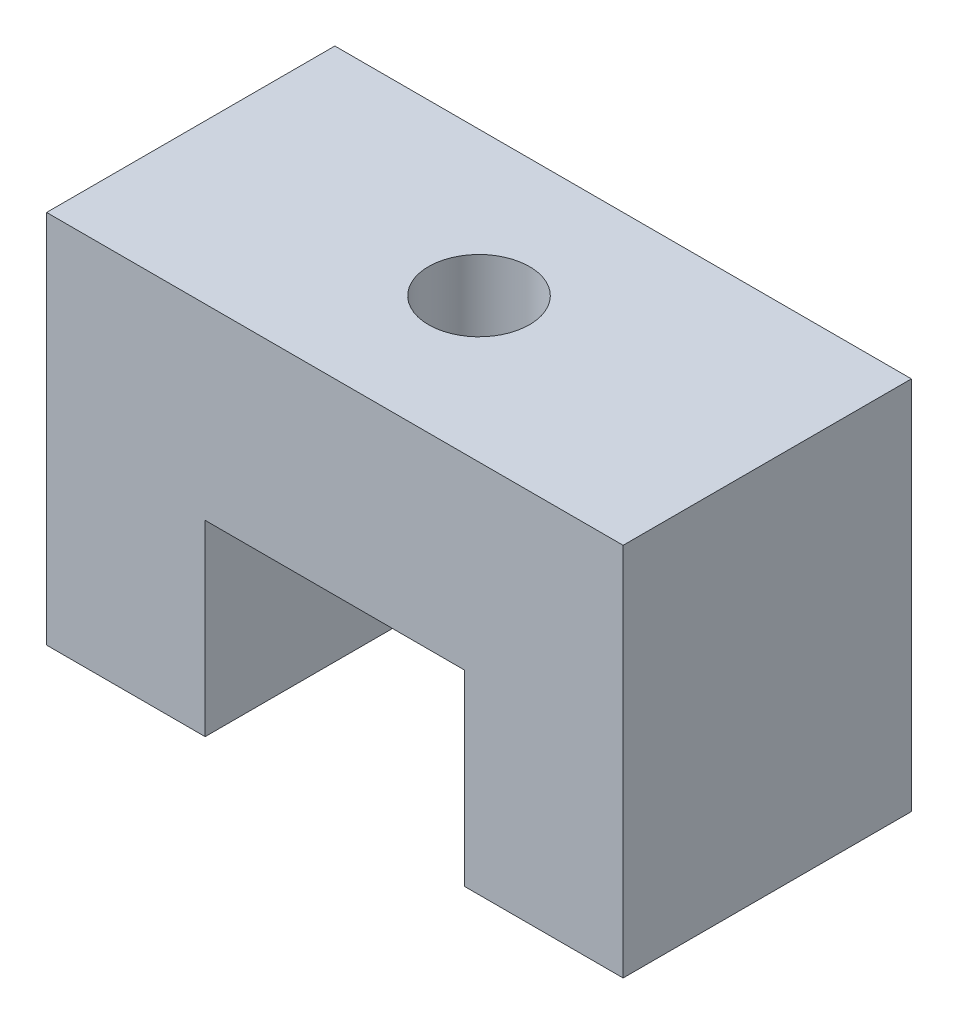
ISO-10303-21;
HEADER;
FILE_DESCRIPTION(('STEP AP214'),'2;1');
FILE_NAME('part.step','',(''),(''),'','','');
FILE_SCHEMA(('AUTOMOTIVE_DESIGN { 1 0 10303 214 1 1 1 1 }'));
ENDSEC;
DATA;
#1=APPLICATION_CONTEXT('core data for automotive mechanical design processes');
#2=APPLICATION_PROTOCOL_DEFINITION('international standard','automotive_design',2000,#1);
#3=PRODUCT_CONTEXT('',#1,'mechanical');
#4=PRODUCT('Part','Part','',(#3));
#5=PRODUCT_RELATED_PRODUCT_CATEGORY('part','',(#4));
#6=PRODUCT_DEFINITION_FORMATION('','',#4);
#7=PRODUCT_DEFINITION_CONTEXT('part definition',#1,'design');
#8=PRODUCT_DEFINITION('design','',#6,#7);
#9=PRODUCT_DEFINITION_SHAPE('','',#8);
#10=(LENGTH_UNIT() NAMED_UNIT(*) SI_UNIT(.MILLI.,.METRE.));
#11=(NAMED_UNIT(*) PLANE_ANGLE_UNIT() SI_UNIT($,.RADIAN.));
#12=(NAMED_UNIT(*) SI_UNIT($,.STERADIAN.) SOLID_ANGLE_UNIT());
#13=UNCERTAINTY_MEASURE_WITH_UNIT(LENGTH_MEASURE(1.E-05),#10,'distance_accuracy_value','');
#14=(GEOMETRIC_REPRESENTATION_CONTEXT(3) GLOBAL_UNCERTAINTY_ASSIGNED_CONTEXT((#13)) GLOBAL_UNIT_ASSIGNED_CONTEXT((#10,
#11,#12)) REPRESENTATION_CONTEXT('',''));
#15=CARTESIAN_POINT('',(0.,0.,0.));
#16=DIRECTION('',(0.,0.,1.));
#17=DIRECTION('',(1.,0.,0.));
#18=AXIS2_PLACEMENT_3D('',#15,#16,#17);
#19=CARTESIAN_POINT('',(0.,0.,5.));
#20=DIRECTION('',(0.,1.,0.));
#21=DIRECTION('',(-1.,0.,0.));
#22=AXIS2_PLACEMENT_3D('',#19,#20,#21);
#23=PLANE('',#22);
#24=CARTESIAN_POINT('',(0.,0.,0.));
#25=DIRECTION('',(0.,1.,0.));
#26=DIRECTION('',(-1.,0.,0.));
#27=AXIS2_PLACEMENT_3D('',#24,#25,#26);
#28=CIRCLE('',#27,1.75);
#29=CARTESIAN_POINT('',(0.,0.,1.75));
#30=VERTEX_POINT('',#29);
#31=EDGE_CURVE('E165',#30,#30,#28,.T.);
#32=ORIENTED_EDGE('',*,*,#31,.T.);
#33=EDGE_LOOP('',(#32));
#34=FACE_BOUND('',#33,.T.);
#35=DIRECTION('',(1.,0.,0.));
#36=VECTOR('',#35,1.);
#37=CARTESIAN_POINT('',(0.,0.,-5.));
#38=LINE('',#37,#36);
#39=CARTESIAN_POINT('',(-4.5,0.,-5.));
#40=VERTEX_POINT('',#39);
#41=CARTESIAN_POINT('',(4.5,0.,-5.));
#42=VERTEX_POINT('',#41);
#43=EDGE_CURVE('E168',#40,#42,#38,.T.);
#44=ORIENTED_EDGE('',*,*,#43,.T.);
#45=DIRECTION('',(0.,0.,-1.));
#46=VECTOR('',#45,1.);
#47=CARTESIAN_POINT('',(4.5,0.,5.));
#48=LINE('',#47,#46);
#49=CARTESIAN_POINT('',(4.5,0.,5.));
#50=VERTEX_POINT('',#49);
#51=EDGE_CURVE('E11',#50,#42,#48,.T.);
#52=ORIENTED_EDGE('',*,*,#51,.F.);
#53=DIRECTION('',(1.,0.,0.));
#54=VECTOR('',#53,1.);
#55=CARTESIAN_POINT('',(0.,0.,5.));
#56=LINE('',#55,#54);
#57=CARTESIAN_POINT('',(-4.5,0.,5.));
#58=VERTEX_POINT('',#57);
#59=EDGE_CURVE('E160',#58,#50,#56,.T.);
#60=ORIENTED_EDGE('',*,*,#59,.F.);
#61=DIRECTION('',(0.,0.,-1.));
#62=VECTOR('',#61,1.);
#63=CARTESIAN_POINT('',(-4.5,0.,5.));
#64=LINE('',#63,#62);
#65=EDGE_CURVE('E65',#58,#40,#64,.T.);
#66=ORIENTED_EDGE('',*,*,#65,.T.);
#67=EDGE_LOOP('',(#44,#52,#60,#66));
#68=FACE_BOUND('',#67,.T.);
#69=ADVANCED_FACE('F47',(#34,#68),#23,.F.);
#70=CARTESIAN_POINT('',(4.5,0.,5.));
#71=DIRECTION('',(1.,0.,0.));
#72=DIRECTION('',(0.,0.,-1.));
#73=AXIS2_PLACEMENT_3D('',#70,#71,#72);
#74=PLANE('',#73);
#75=DIRECTION('',(0.,-1.,0.));
#76=VECTOR('',#75,1.);
#77=CARTESIAN_POINT('',(4.5,0.,-5.));
#78=LINE('',#77,#76);
#79=CARTESIAN_POINT('',(4.5,-6.5,-5.));
#80=VERTEX_POINT('',#79);
#81=EDGE_CURVE('E172',#42,#80,#78,.T.);
#82=ORIENTED_EDGE('',*,*,#81,.T.);
#83=DIRECTION('',(0.,0.,-1.));
#84=VECTOR('',#83,1.);
#85=CARTESIAN_POINT('',(4.5,-6.5,5.));
#86=LINE('',#85,#84);
#87=CARTESIAN_POINT('',(4.5,-6.5,5.));
#88=VERTEX_POINT('',#87);
#89=EDGE_CURVE('E57',#88,#80,#86,.T.);
#90=ORIENTED_EDGE('',*,*,#89,.F.);
#91=DIRECTION('',(0.,-1.,0.));
#92=VECTOR('',#91,1.);
#93=CARTESIAN_POINT('',(4.5,0.,5.));
#94=LINE('',#93,#92);
#95=EDGE_CURVE('E104',#50,#88,#94,.T.);
#96=ORIENTED_EDGE('',*,*,#95,.F.);
#97=ORIENTED_EDGE('',*,*,#51,.T.);
#98=EDGE_LOOP('',(#82,#90,#96,#97));
#99=FACE_BOUND('',#98,.T.);
#100=ADVANCED_FACE('F238',(#99),#74,.F.);
#101=CARTESIAN_POINT('',(0.,-6.5,5.));
#102=DIRECTION('',(0.,1.,0.));
#103=DIRECTION('',(0.,0.,1.));
#104=AXIS2_PLACEMENT_3D('',#101,#102,#103);
#105=PLANE('',#104);
#106=DIRECTION('',(1.,0.,0.));
#107=VECTOR('',#106,1.);
#108=CARTESIAN_POINT('',(0.,-6.5,-5.));
#109=LINE('',#108,#107);
#110=CARTESIAN_POINT('',(10.,-6.5,-5.));
#111=VERTEX_POINT('',#110);
#112=EDGE_CURVE('E201',#80,#111,#109,.T.);
#113=ORIENTED_EDGE('',*,*,#112,.T.);
#114=DIRECTION('',(0.,0.,-1.));
#115=VECTOR('',#114,1.);
#116=CARTESIAN_POINT('',(10.,-6.5,5.));
#117=LINE('',#116,#115);
#118=CARTESIAN_POINT('',(10.,-6.5,5.));
#119=VERTEX_POINT('',#118);
#120=EDGE_CURVE('E214',#119,#111,#117,.T.);
#121=ORIENTED_EDGE('',*,*,#120,.F.);
#122=DIRECTION('',(1.,0.,0.));
#123=VECTOR('',#122,1.);
#124=CARTESIAN_POINT('',(0.,-6.5,5.));
#125=LINE('',#124,#123);
#126=EDGE_CURVE('E146',#88,#119,#125,.T.);
#127=ORIENTED_EDGE('',*,*,#126,.F.);
#128=ORIENTED_EDGE('',*,*,#89,.T.);
#129=EDGE_LOOP('',(#113,#121,#127,#128));
#130=FACE_BOUND('',#129,.T.);
#131=ADVANCED_FACE('F222',(#130),#105,.F.);
#132=CARTESIAN_POINT('',(10.,0.,5.));
#133=DIRECTION('',(1.,0.,0.));
#134=DIRECTION('',(0.,0.,-1.));
#135=AXIS2_PLACEMENT_3D('',#132,#133,#134);
#136=PLANE('',#135);
#137=DIRECTION('',(0.,-1.,0.));
#138=VECTOR('',#137,1.);
#139=CARTESIAN_POINT('',(10.,0.,-5.));
#140=LINE('',#139,#138);
#141=CARTESIAN_POINT('',(10.,6.5,-5.));
#142=VERTEX_POINT('',#141);
#143=EDGE_CURVE('E195',#142,#111,#140,.T.);
#144=ORIENTED_EDGE('',*,*,#143,.F.);
#145=DIRECTION('',(0.,0.,-1.));
#146=VECTOR('',#145,1.);
#147=CARTESIAN_POINT('',(10.,6.5,5.));
#148=LINE('',#147,#146);
#149=CARTESIAN_POINT('',(10.,6.5,5.));
#150=VERTEX_POINT('',#149);
#151=EDGE_CURVE('E191',#150,#142,#148,.T.);
#152=ORIENTED_EDGE('',*,*,#151,.F.);
#153=DIRECTION('',(0.,-1.,0.));
#154=VECTOR('',#153,1.);
#155=CARTESIAN_POINT('',(10.,0.,5.));
#156=LINE('',#155,#154);
#157=EDGE_CURVE('E153',#150,#119,#156,.T.);
#158=ORIENTED_EDGE('',*,*,#157,.T.);
#159=ORIENTED_EDGE('',*,*,#120,.T.);
#160=EDGE_LOOP('',(#144,#152,#158,#159));
#161=FACE_BOUND('',#160,.T.);
#162=ADVANCED_FACE('F186',(#161),#136,.T.);
#163=CARTESIAN_POINT('',(0.,6.5,5.));
#164=DIRECTION('',(0.,1.,0.));
#165=DIRECTION('',(0.,0.,1.));
#166=AXIS2_PLACEMENT_3D('',#163,#164,#165);
#167=PLANE('',#166);
#168=CARTESIAN_POINT('',(0.,6.5,0.));
#169=DIRECTION('',(0.,1.,0.));
#170=DIRECTION('',(0.,0.,1.));
#171=AXIS2_PLACEMENT_3D('',#168,#169,#170);
#172=CIRCLE('',#171,1.75);
#173=CARTESIAN_POINT('',(0.,6.5,1.75));
#174=VERTEX_POINT('',#173);
#175=EDGE_CURVE('E50',#174,#174,#172,.T.);
#176=ORIENTED_EDGE('',*,*,#175,.F.);
#177=EDGE_LOOP('',(#176));
#178=FACE_BOUND('',#177,.T.);
#179=DIRECTION('',(1.,0.,0.));
#180=VECTOR('',#179,1.);
#181=CARTESIAN_POINT('',(0.,6.5,-5.));
#182=LINE('',#181,#180);
#183=CARTESIAN_POINT('',(-10.,6.5,-5.));
#184=VERTEX_POINT('',#183);
#185=EDGE_CURVE('E190',#184,#142,#182,.T.);
#186=ORIENTED_EDGE('',*,*,#185,.F.);
#187=DIRECTION('',(0.,0.,-1.));
#188=VECTOR('',#187,1.);
#189=CARTESIAN_POINT('',(-10.,6.5,5.));
#190=LINE('',#189,#188);
#191=CARTESIAN_POINT('',(-10.,6.5,5.));
#192=VERTEX_POINT('',#191);
#193=EDGE_CURVE('E140',#192,#184,#190,.T.);
#194=ORIENTED_EDGE('',*,*,#193,.F.);
#195=DIRECTION('',(1.,0.,0.));
#196=VECTOR('',#195,1.);
#197=CARTESIAN_POINT('',(0.,6.5,5.));
#198=LINE('',#197,#196);
#199=EDGE_CURVE('E128',#192,#150,#198,.T.);
#200=ORIENTED_EDGE('',*,*,#199,.T.);
#201=ORIENTED_EDGE('',*,*,#151,.T.);
#202=EDGE_LOOP('',(#186,#194,#200,#201));
#203=FACE_BOUND('',#202,.T.);
#204=ADVANCED_FACE('F183',(#178,#203),#167,.T.);
#205=CARTESIAN_POINT('',(-10.,0.,5.));
#206=DIRECTION('',(1.,0.,0.));
#207=DIRECTION('',(0.,0.,-1.));
#208=AXIS2_PLACEMENT_3D('',#205,#206,#207);
#209=PLANE('',#208);
#210=DIRECTION('',(0.,-1.,0.));
#211=VECTOR('',#210,1.);
#212=CARTESIAN_POINT('',(-10.,0.,-5.));
#213=LINE('',#212,#211);
#214=CARTESIAN_POINT('',(-10.,-6.5,-5.));
#215=VERTEX_POINT('',#214);
#216=EDGE_CURVE('E136',#184,#215,#213,.T.);
#217=ORIENTED_EDGE('',*,*,#216,.T.);
#218=DIRECTION('',(0.,0.,-1.));
#219=VECTOR('',#218,1.);
#220=CARTESIAN_POINT('',(-10.,-6.5,5.));
#221=LINE('',#220,#219);
#222=CARTESIAN_POINT('',(-10.,-6.5,5.));
#223=VERTEX_POINT('',#222);
#224=EDGE_CURVE('E133',#223,#215,#221,.T.);
#225=ORIENTED_EDGE('',*,*,#224,.F.);
#226=DIRECTION('',(0.,-1.,0.));
#227=VECTOR('',#226,1.);
#228=CARTESIAN_POINT('',(-10.,0.,5.));
#229=LINE('',#228,#227);
#230=EDGE_CURVE('E120',#192,#223,#229,.T.);
#231=ORIENTED_EDGE('',*,*,#230,.F.);
#232=ORIENTED_EDGE('',*,*,#193,.T.);
#233=EDGE_LOOP('',(#217,#225,#231,#232));
#234=FACE_BOUND('',#233,.T.);
#235=ADVANCED_FACE('F134',(#234),#209,.F.);
#236=CARTESIAN_POINT('',(-4.5,-6.5,-5.));
#237=VERTEX_POINT('',#236);
#238=EDGE_CURVE('E198',#215,#237,#109,.T.);
#239=ORIENTED_EDGE('',*,*,#238,.T.);
#240=DIRECTION('',(0.,0.,-1.));
#241=VECTOR('',#240,1.);
#242=CARTESIAN_POINT('',(-4.5,-6.5,5.));
#243=LINE('',#242,#241);
#244=CARTESIAN_POINT('',(-4.5,-6.5,5.));
#245=VERTEX_POINT('',#244);
#246=EDGE_CURVE('E92',#245,#237,#243,.T.);
#247=ORIENTED_EDGE('',*,*,#246,.F.);
#248=EDGE_CURVE('E125',#223,#245,#125,.T.);
#249=ORIENTED_EDGE('',*,*,#248,.F.);
#250=ORIENTED_EDGE('',*,*,#224,.T.);
#251=EDGE_LOOP('',(#239,#247,#249,#250));
#252=FACE_BOUND('',#251,.T.);
#253=ADVANCED_FACE('F142',(#252),#105,.F.);
#254=CARTESIAN_POINT('',(-4.5,0.,5.));
#255=DIRECTION('',(1.,0.,0.));
#256=DIRECTION('',(0.,0.,-1.));
#257=AXIS2_PLACEMENT_3D('',#254,#255,#256);
#258=PLANE('',#257);
#259=DIRECTION('',(0.,-1.,0.));
#260=VECTOR('',#259,1.);
#261=CARTESIAN_POINT('',(-4.5,0.,-5.));
#262=LINE('',#261,#260);
#263=EDGE_CURVE('E162',#40,#237,#262,.T.);
#264=ORIENTED_EDGE('',*,*,#263,.F.);
#265=ORIENTED_EDGE('',*,*,#65,.F.);
#266=DIRECTION('',(0.,-1.,0.));
#267=VECTOR('',#266,1.);
#268=CARTESIAN_POINT('',(-4.5,0.,5.));
#269=LINE('',#268,#267);
#270=EDGE_CURVE('E144',#58,#245,#269,.T.);
#271=ORIENTED_EDGE('',*,*,#270,.T.);
#272=ORIENTED_EDGE('',*,*,#246,.T.);
#273=EDGE_LOOP('',(#264,#265,#271,#272));
#274=FACE_BOUND('',#273,.T.);
#275=ADVANCED_FACE('F228',(#274),#258,.T.);
#276=CARTESIAN_POINT('',(0.,0.,5.));
#277=DIRECTION('',(0.,0.,1.));
#278=DIRECTION('',(1.,0.,0.));
#279=AXIS2_PLACEMENT_3D('',#276,#277,#278);
#280=PLANE('',#279);
#281=ORIENTED_EDGE('',*,*,#59,.T.);
#282=ORIENTED_EDGE('',*,*,#95,.T.);
#283=ORIENTED_EDGE('',*,*,#126,.T.);
#284=ORIENTED_EDGE('',*,*,#157,.F.);
#285=ORIENTED_EDGE('',*,*,#199,.F.);
#286=ORIENTED_EDGE('',*,*,#230,.T.);
#287=ORIENTED_EDGE('',*,*,#248,.T.);
#288=ORIENTED_EDGE('',*,*,#270,.F.);
#289=EDGE_LOOP('',(#281,#282,#283,#284,#285,#286,#287,#288));
#290=FACE_BOUND('',#289,.T.);
#291=ADVANCED_FACE('F122',(#290),#280,.T.);
#292=CARTESIAN_POINT('',(0.,0.,-5.));
#293=DIRECTION('',(0.,0.,1.));
#294=DIRECTION('',(1.,0.,0.));
#295=AXIS2_PLACEMENT_3D('',#292,#293,#294);
#296=PLANE('',#295);
#297=ORIENTED_EDGE('',*,*,#43,.F.);
#298=ORIENTED_EDGE('',*,*,#263,.T.);
#299=ORIENTED_EDGE('',*,*,#238,.F.);
#300=ORIENTED_EDGE('',*,*,#216,.F.);
#301=ORIENTED_EDGE('',*,*,#185,.T.);
#302=ORIENTED_EDGE('',*,*,#143,.T.);
#303=ORIENTED_EDGE('',*,*,#112,.F.);
#304=ORIENTED_EDGE('',*,*,#81,.F.);
#305=EDGE_LOOP('',(#297,#298,#299,#300,#301,#302,#303,#304));
#306=FACE_BOUND('',#305,.T.);
#307=ADVANCED_FACE('F223',(#306),#296,.F.);
#308=CARTESIAN_POINT('',(0.,-6.5,0.));
#309=DIRECTION('',(0.,1.,0.));
#310=DIRECTION('',(0.,0.,1.));
#311=AXIS2_PLACEMENT_3D('',#308,#309,#310);
#312=CYLINDRICAL_SURFACE('',#311,1.75);
#313=CARTESIAN_POINT('',(0.,6.5,1.75));
#314=CARTESIAN_POINT('',(0.,6.43229166666667,1.75));
#315=CARTESIAN_POINT('',(0.,6.36458333333333,1.75));
#316=CARTESIAN_POINT('',(0.,6.22916666666667,1.75));
#317=CARTESIAN_POINT('',(0.,6.16145833333333,1.75));
#318=CARTESIAN_POINT('',(0.,6.02604166666667,1.75));
#319=CARTESIAN_POINT('',(0.,5.95833333333333,1.75));
#320=CARTESIAN_POINT('',(0.,5.82291666666666,1.75));
#321=CARTESIAN_POINT('',(0.,5.75520833333333,1.75));
#322=CARTESIAN_POINT('',(0.,5.61979166666667,1.75));
#323=CARTESIAN_POINT('',(0.,5.55208333333333,1.75));
#324=CARTESIAN_POINT('',(0.,5.41666666666667,1.75));
#325=CARTESIAN_POINT('',(0.,5.34895833333333,1.75));
#326=CARTESIAN_POINT('',(0.,5.21354166666667,1.75));
#327=CARTESIAN_POINT('',(0.,5.14583333333333,1.75));
#328=CARTESIAN_POINT('',(0.,5.01041666666667,1.75));
#329=CARTESIAN_POINT('',(0.,4.94270833333333,1.75));
#330=CARTESIAN_POINT('',(0.,4.80729166666667,1.75));
#331=CARTESIAN_POINT('',(0.,4.73958333333333,1.75));
#332=CARTESIAN_POINT('',(0.,4.60416666666667,1.75));
#333=CARTESIAN_POINT('',(0.,4.53645833333333,1.75));
#334=CARTESIAN_POINT('',(0.,4.40104166666667,1.75));
#335=CARTESIAN_POINT('',(0.,4.33333333333333,1.75));
#336=CARTESIAN_POINT('',(0.,4.19791666666667,1.75));
#337=CARTESIAN_POINT('',(0.,4.13020833333333,1.75));
#338=CARTESIAN_POINT('',(0.,3.99479166666666,1.75));
#339=CARTESIAN_POINT('',(0.,3.92708333333333,1.75));
#340=CARTESIAN_POINT('',(0.,3.79166666666667,1.75));
#341=CARTESIAN_POINT('',(0.,3.72395833333333,1.75));
#342=CARTESIAN_POINT('',(0.,3.58854166666666,1.75));
#343=CARTESIAN_POINT('',(0.,3.52083333333333,1.75));
#344=CARTESIAN_POINT('',(0.,3.38541666666667,1.75));
#345=CARTESIAN_POINT('',(0.,3.31770833333333,1.75));
#346=CARTESIAN_POINT('',(0.,3.18229166666667,1.75));
#347=CARTESIAN_POINT('',(0.,3.11458333333333,1.75));
#348=CARTESIAN_POINT('',(0.,2.97916666666666,1.75));
#349=CARTESIAN_POINT('',(0.,2.91145833333333,1.75));
#350=CARTESIAN_POINT('',(0.,2.77604166666667,1.75));
#351=CARTESIAN_POINT('',(0.,2.70833333333333,1.75));
#352=CARTESIAN_POINT('',(0.,2.57291666666667,1.75));
#353=CARTESIAN_POINT('',(0.,2.50520833333333,1.75));
#354=CARTESIAN_POINT('',(0.,2.36979166666667,1.75));
#355=CARTESIAN_POINT('',(0.,2.30208333333333,1.75));
#356=CARTESIAN_POINT('',(0.,2.16666666666667,1.75));
#357=CARTESIAN_POINT('',(0.,2.09895833333333,1.75));
#358=CARTESIAN_POINT('',(0.,1.96354166666667,1.75));
#359=CARTESIAN_POINT('',(0.,1.89583333333333,1.75));
#360=CARTESIAN_POINT('',(0.,1.76041666666666,1.75));
#361=CARTESIAN_POINT('',(0.,1.69270833333333,1.75));
#362=CARTESIAN_POINT('',(0.,1.55729166666667,1.75));
#363=CARTESIAN_POINT('',(0.,1.48958333333333,1.75));
#364=CARTESIAN_POINT('',(0.,1.35416666666667,1.75));
#365=CARTESIAN_POINT('',(0.,1.28645833333333,1.75));
#366=CARTESIAN_POINT('',(0.,1.15104166666667,1.75));
#367=CARTESIAN_POINT('',(0.,1.08333333333333,1.75));
#368=CARTESIAN_POINT('',(0.,0.947916666666666,1.75));
#369=CARTESIAN_POINT('',(0.,0.880208333333332,1.75));
#370=CARTESIAN_POINT('',(0.,0.744791666666666,1.75));
#371=CARTESIAN_POINT('',(0.,0.677083333333332,1.75));
#372=CARTESIAN_POINT('',(0.,0.541666666666666,1.75));
#373=CARTESIAN_POINT('',(0.,0.473958333333333,1.75));
#374=CARTESIAN_POINT('',(0.,0.338541666666666,1.75));
#375=CARTESIAN_POINT('',(0.,0.270833333333333,1.75));
#376=CARTESIAN_POINT('',(0.,0.135416666666666,1.75));
#377=CARTESIAN_POINT('',(0.,0.0677083333333326,1.75));
#378=CARTESIAN_POINT('',(0.,0.,1.75));
#379=B_SPLINE_CURVE_WITH_KNOTS('',3,(#313,#314,#315,#316,#317,#318,#319,#320,#321,#322,#323,
#324,#325,#326,#327,#328,#329,#330,#331,#332,#333,#334,#335,#336,#337,#338,#339,#340,#341,#342,
#343,#344,#345,#346,#347,#348,#349,#350,#351,#352,#353,#354,#355,#356,#357,#358,#359,#360,#361,
#362,#363,#364,#365,#366,#367,#368,#369,#370,#371,#372,#373,#374,#375,#376,#377,#378),
.UNSPECIFIED.,.F.,.F.,(4,2,2,2,2,2,2,2,2,2,2,2,2,2,2,2,2,2,2,2,2,2,2,2,2,2,2,2,2,2,2,2,4),(0.,
0.203125,0.40625,0.609375000000001,0.812500000000001,1.015625,1.21875,1.421875,1.625,1.828125,
2.03125,2.234375,2.4375,2.640625,2.84375,3.046875,3.25,3.453125,3.65625,3.859375,4.0625,
4.265625,4.46875,4.671875,4.875,5.078125,5.28125,5.484375,5.6875,5.890625,6.09375,6.296875,6.5),.UNSPECIFIED.);
#380=EDGE_CURVE('BSEAM180',#174,#30,#379,.T.);
#381=ORIENTED_EDGE('',*,*,#175,.T.);
#382=ORIENTED_EDGE('',*,*,#31,.F.);
#383=ORIENTED_EDGE('',*,*,#380,.T.);
#384=ORIENTED_EDGE('',*,*,#380,.F.);
#385=EDGE_LOOP('',(#381,#383,#382,#384));
#386=FACE_BOUND('',#385,.T.);
#387=ADVANCED_FACE('F180',(#386),#312,.F.);
#388=CLOSED_SHELL('',(#69,#100,#131,#162,#204,#235,#253,#275,#291,#307,#387));
#389=MANIFOLD_SOLID_BREP('B2',#388);
#390=ADVANCED_BREP_SHAPE_REPRESENTATION('',(#18,#389),#14);
#391=SHAPE_DEFINITION_REPRESENTATION(#9,#390);
ENDSEC;
END-ISO-10303-21;
